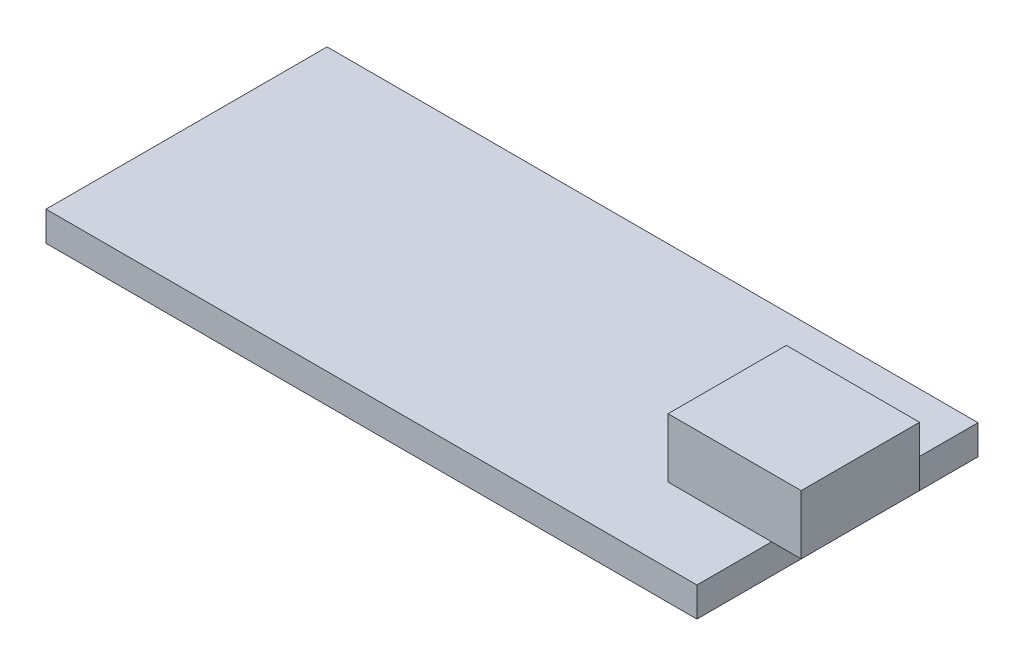
ISO-10303-21;
HEADER;
FILE_DESCRIPTION(('STEP AP214'),'2;1');
FILE_NAME('part.step','',(''),(''),'','','');
FILE_SCHEMA(('AUTOMOTIVE_DESIGN { 1 0 10303 214 1 1 1 1 }'));
ENDSEC;
DATA;
#1=APPLICATION_CONTEXT('core data for automotive mechanical design processes');
#2=APPLICATION_PROTOCOL_DEFINITION('international standard','automotive_design',2000,#1);
#3=PRODUCT_CONTEXT('',#1,'mechanical');
#4=PRODUCT('Part','Part','',(#3));
#5=PRODUCT_RELATED_PRODUCT_CATEGORY('part','',(#4));
#6=PRODUCT_DEFINITION_FORMATION('','',#4);
#7=PRODUCT_DEFINITION_CONTEXT('part definition',#1,'design');
#8=PRODUCT_DEFINITION('design','',#6,#7);
#9=PRODUCT_DEFINITION_SHAPE('','',#8);
#10=(LENGTH_UNIT() NAMED_UNIT(*) SI_UNIT(.MILLI.,.METRE.));
#11=(NAMED_UNIT(*) PLANE_ANGLE_UNIT() SI_UNIT($,.RADIAN.));
#12=(NAMED_UNIT(*) SI_UNIT($,.STERADIAN.) SOLID_ANGLE_UNIT());
#13=UNCERTAINTY_MEASURE_WITH_UNIT(LENGTH_MEASURE(1.E-05),#10,'distance_accuracy_value','');
#14=(GEOMETRIC_REPRESENTATION_CONTEXT(3) GLOBAL_UNCERTAINTY_ASSIGNED_CONTEXT((#13)) GLOBAL_UNIT_ASSIGNED_CONTEXT((#10,
#11,#12)) REPRESENTATION_CONTEXT('',''));
#15=CARTESIAN_POINT('',(0.,0.,0.));
#16=DIRECTION('',(0.,0.,1.));
#17=DIRECTION('',(1.,0.,0.));
#18=AXIS2_PLACEMENT_3D('',#15,#16,#17);
#19=CARTESIAN_POINT('',(0.,2.,0.));
#20=DIRECTION('',(0.,-1.,0.));
#21=DIRECTION('',(0.,0.,-1.));
#22=AXIS2_PLACEMENT_3D('',#19,#20,#21);
#23=PLANE('',#22);
#24=DIRECTION('',(-1.,0.,0.));
#25=VECTOR('',#24,1.);
#26=CARTESIAN_POINT('',(24.,2.,-3.54883693772484));
#27=LINE('',#26,#25);
#28=CARTESIAN_POINT('',(22.,2.,-3.54883693772484));
#29=VERTEX_POINT('',#28);
#30=CARTESIAN_POINT('',(15.,2.,-3.54883693772484));
#31=VERTEX_POINT('',#30);
#32=EDGE_CURVE('E11',#29,#31,#27,.T.);
#33=ORIENTED_EDGE('',*,*,#32,.F.);
#34=DIRECTION('',(0.,0.,-1.));
#35=VECTOR('',#34,1.);
#36=CARTESIAN_POINT('',(22.,2.,9.5));
#37=LINE('',#36,#35);
#38=CARTESIAN_POINT('',(22.,2.,-9.5));
#39=VERTEX_POINT('',#38);
#40=EDGE_CURVE('E150',#29,#39,#37,.T.);
#41=ORIENTED_EDGE('',*,*,#40,.T.);
#42=DIRECTION('',(-1.,0.,0.));
#43=VECTOR('',#42,1.);
#44=CARTESIAN_POINT('',(-22.,2.,-9.5));
#45=LINE('',#44,#43);
#46=CARTESIAN_POINT('',(-22.,2.,-9.5));
#47=VERTEX_POINT('',#46);
#48=EDGE_CURVE('E148',#39,#47,#45,.T.);
#49=ORIENTED_EDGE('',*,*,#48,.T.);
#50=DIRECTION('',(0.,0.,1.));
#51=VECTOR('',#50,1.);
#52=CARTESIAN_POINT('',(-22.,2.,9.5));
#53=LINE('',#52,#51);
#54=CARTESIAN_POINT('',(-22.,2.,9.5));
#55=VERTEX_POINT('',#54);
#56=EDGE_CURVE('E153',#47,#55,#53,.T.);
#57=ORIENTED_EDGE('',*,*,#56,.T.);
#58=DIRECTION('',(1.,0.,0.));
#59=VECTOR('',#58,1.);
#60=CARTESIAN_POINT('',(-22.,2.,9.5));
#61=LINE('',#60,#59);
#62=CARTESIAN_POINT('',(22.,2.,9.5));
#63=VERTEX_POINT('',#62);
#64=EDGE_CURVE('E156',#55,#63,#61,.T.);
#65=ORIENTED_EDGE('',*,*,#64,.T.);
#66=CARTESIAN_POINT('',(22.,2.,4.45116306227516));
#67=VERTEX_POINT('',#66);
#68=EDGE_CURVE('E145',#63,#67,#37,.T.);
#69=ORIENTED_EDGE('',*,*,#68,.T.);
#70=DIRECTION('',(1.,0.,0.));
#71=VECTOR('',#70,1.);
#72=CARTESIAN_POINT('',(24.,2.,4.45116306227516));
#73=LINE('',#72,#71);
#74=CARTESIAN_POINT('',(15.,2.,4.45116306227516));
#75=VERTEX_POINT('',#74);
#76=EDGE_CURVE('E61',#75,#67,#73,.T.);
#77=ORIENTED_EDGE('',*,*,#76,.F.);
#78=DIRECTION('',(0.,0.,1.));
#79=VECTOR('',#78,1.);
#80=CARTESIAN_POINT('',(15.,2.,4.45116306227516));
#81=LINE('',#80,#79);
#82=EDGE_CURVE('E57',#31,#75,#81,.T.);
#83=ORIENTED_EDGE('',*,*,#82,.F.);
#84=EDGE_LOOP('',(#33,#41,#49,#57,#65,#69,#77,#83));
#85=FACE_BOUND('',#84,.T.);
#86=ADVANCED_FACE('F39',(#85),#23,.F.);
#87=CARTESIAN_POINT('',(22.,2.,9.5));
#88=DIRECTION('',(-1.,0.,0.));
#89=DIRECTION('',(0.,0.,1.));
#90=AXIS2_PLACEMENT_3D('',#87,#88,#89);
#91=PLANE('',#90);
#92=DIRECTION('',(0.,0.,-1.));
#93=VECTOR('',#92,1.);
#94=CARTESIAN_POINT('',(22.,0.,9.5));
#95=LINE('',#94,#93);
#96=CARTESIAN_POINT('',(22.,0.,9.5));
#97=VERTEX_POINT('',#96);
#98=CARTESIAN_POINT('',(22.,0.,-9.5));
#99=VERTEX_POINT('',#98);
#100=EDGE_CURVE('E134',#97,#99,#95,.T.);
#101=ORIENTED_EDGE('',*,*,#100,.T.);
#102=DIRECTION('',(0.,-1.,0.));
#103=VECTOR('',#102,1.);
#104=CARTESIAN_POINT('',(22.,2.,-9.5));
#105=LINE('',#104,#103);
#106=EDGE_CURVE('E43',#39,#99,#105,.T.);
#107=ORIENTED_EDGE('',*,*,#106,.F.);
#108=ORIENTED_EDGE('',*,*,#40,.F.);
#109=EDGE_CURVE('E149',#67,#29,#37,.T.);
#110=ORIENTED_EDGE('',*,*,#109,.F.);
#111=ORIENTED_EDGE('',*,*,#68,.F.);
#112=DIRECTION('',(0.,-1.,0.));
#113=VECTOR('',#112,1.);
#114=CARTESIAN_POINT('',(22.,2.,9.5));
#115=LINE('',#114,#113);
#116=EDGE_CURVE('E158',#63,#97,#115,.T.);
#117=ORIENTED_EDGE('',*,*,#116,.T.);
#118=EDGE_LOOP('',(#101,#107,#108,#110,#111,#117));
#119=FACE_BOUND('',#118,.T.);
#120=ADVANCED_FACE('F41',(#119),#91,.F.);
#121=CARTESIAN_POINT('',(-22.,2.,-9.5));
#122=DIRECTION('',(0.,0.,1.));
#123=DIRECTION('',(1.,0.,0.));
#124=AXIS2_PLACEMENT_3D('',#121,#122,#123);
#125=PLANE('',#124);
#126=DIRECTION('',(-1.,0.,0.));
#127=VECTOR('',#126,1.);
#128=CARTESIAN_POINT('',(-22.,0.,-9.5));
#129=LINE('',#128,#127);
#130=CARTESIAN_POINT('',(-22.,0.,-9.5));
#131=VERTEX_POINT('',#130);
#132=EDGE_CURVE('E139',#99,#131,#129,.T.);
#133=ORIENTED_EDGE('',*,*,#132,.T.);
#134=DIRECTION('',(0.,-1.,0.));
#135=VECTOR('',#134,1.);
#136=CARTESIAN_POINT('',(-22.,2.,-9.5));
#137=LINE('',#136,#135);
#138=EDGE_CURVE('E174',#47,#131,#137,.T.);
#139=ORIENTED_EDGE('',*,*,#138,.F.);
#140=ORIENTED_EDGE('',*,*,#48,.F.);
#141=ORIENTED_EDGE('',*,*,#106,.T.);
#142=EDGE_LOOP('',(#133,#139,#140,#141));
#143=FACE_BOUND('',#142,.T.);
#144=ADVANCED_FACE('F186',(#143),#125,.F.);
#145=CARTESIAN_POINT('',(-22.,2.,9.5));
#146=DIRECTION('',(1.,0.,0.));
#147=DIRECTION('',(0.,0.,-1.));
#148=AXIS2_PLACEMENT_3D('',#145,#146,#147);
#149=PLANE('',#148);
#150=DIRECTION('',(0.,0.,1.));
#151=VECTOR('',#150,1.);
#152=CARTESIAN_POINT('',(-22.,0.,9.5));
#153=LINE('',#152,#151);
#154=CARTESIAN_POINT('',(-22.,0.,9.5));
#155=VERTEX_POINT('',#154);
#156=EDGE_CURVE('E162',#131,#155,#153,.T.);
#157=ORIENTED_EDGE('',*,*,#156,.T.);
#158=DIRECTION('',(0.,-1.,0.));
#159=VECTOR('',#158,1.);
#160=CARTESIAN_POINT('',(-22.,2.,9.5));
#161=LINE('',#160,#159);
#162=EDGE_CURVE('E171',#55,#155,#161,.T.);
#163=ORIENTED_EDGE('',*,*,#162,.F.);
#164=ORIENTED_EDGE('',*,*,#56,.F.);
#165=ORIENTED_EDGE('',*,*,#138,.T.);
#166=EDGE_LOOP('',(#157,#163,#164,#165));
#167=FACE_BOUND('',#166,.T.);
#168=ADVANCED_FACE('F196',(#167),#149,.F.);
#169=CARTESIAN_POINT('',(-22.,2.,9.5));
#170=DIRECTION('',(0.,0.,-1.));
#171=DIRECTION('',(-1.,0.,0.));
#172=AXIS2_PLACEMENT_3D('',#169,#170,#171);
#173=PLANE('',#172);
#174=DIRECTION('',(1.,0.,0.));
#175=VECTOR('',#174,1.);
#176=CARTESIAN_POINT('',(-22.,0.,9.5));
#177=LINE('',#176,#175);
#178=EDGE_CURVE('E165',#155,#97,#177,.T.);
#179=ORIENTED_EDGE('',*,*,#178,.T.);
#180=ORIENTED_EDGE('',*,*,#116,.F.);
#181=ORIENTED_EDGE('',*,*,#64,.F.);
#182=ORIENTED_EDGE('',*,*,#162,.T.);
#183=EDGE_LOOP('',(#179,#180,#181,#182));
#184=FACE_BOUND('',#183,.T.);
#185=ADVANCED_FACE('F199',(#184),#173,.F.);
#186=CARTESIAN_POINT('',(0.,0.,0.));
#187=DIRECTION('',(0.,-1.,0.));
#188=DIRECTION('',(0.,0.,-1.));
#189=AXIS2_PLACEMENT_3D('',#186,#187,#188);
#190=PLANE('',#189);
#191=ORIENTED_EDGE('',*,*,#100,.F.);
#192=ORIENTED_EDGE('',*,*,#178,.F.);
#193=ORIENTED_EDGE('',*,*,#156,.F.);
#194=ORIENTED_EDGE('',*,*,#132,.F.);
#195=EDGE_LOOP('',(#191,#192,#193,#194));
#196=FACE_BOUND('',#195,.T.);
#197=ADVANCED_FACE('F194',(#196),#190,.T.);
#198=CARTESIAN_POINT('',(0.,2.,0.));
#199=DIRECTION('',(0.,1.,0.));
#200=DIRECTION('',(0.,0.,1.));
#201=AXIS2_PLACEMENT_3D('',#198,#199,#200);
#202=PLANE('',#201);
#203=CARTESIAN_POINT('',(24.,2.,4.45116306227516));
#204=VERTEX_POINT('',#203);
#205=EDGE_CURVE('E210',#67,#204,#73,.T.);
#206=ORIENTED_EDGE('',*,*,#205,.F.);
#207=ORIENTED_EDGE('',*,*,#109,.T.);
#208=CARTESIAN_POINT('',(24.,2.,-3.54883693772484));
#209=VERTEX_POINT('',#208);
#210=EDGE_CURVE('E50',#209,#29,#27,.T.);
#211=ORIENTED_EDGE('',*,*,#210,.F.);
#212=DIRECTION('',(0.,0.,-1.));
#213=VECTOR('',#212,1.);
#214=CARTESIAN_POINT('',(24.,2.,4.45116306227516));
#215=LINE('',#214,#213);
#216=EDGE_CURVE('E216',#204,#209,#215,.T.);
#217=ORIENTED_EDGE('',*,*,#216,.F.);
#218=EDGE_LOOP('',(#206,#207,#211,#217));
#219=FACE_BOUND('',#218,.T.);
#220=ADVANCED_FACE('F208',(#219),#202,.F.);
#221=CARTESIAN_POINT('',(15.,6.,4.45116306227516));
#222=DIRECTION('',(1.,0.,0.));
#223=DIRECTION('',(0.,0.,-1.));
#224=AXIS2_PLACEMENT_3D('',#221,#222,#223);
#225=PLANE('',#224);
#226=ORIENTED_EDGE('',*,*,#82,.T.);
#227=DIRECTION('',(0.,-1.,0.));
#228=VECTOR('',#227,1.);
#229=CARTESIAN_POINT('',(15.,6.,4.45116306227516));
#230=LINE('',#229,#228);
#231=CARTESIAN_POINT('',(15.,6.,4.45116306227516));
#232=VERTEX_POINT('',#231);
#233=EDGE_CURVE('E114',#232,#75,#230,.T.);
#234=ORIENTED_EDGE('',*,*,#233,.F.);
#235=DIRECTION('',(0.,0.,1.));
#236=VECTOR('',#235,1.);
#237=CARTESIAN_POINT('',(15.,6.,4.45116306227516));
#238=LINE('',#237,#236);
#239=CARTESIAN_POINT('',(15.,6.,-3.54883693772484));
#240=VERTEX_POINT('',#239);
#241=EDGE_CURVE('E121',#240,#232,#238,.T.);
#242=ORIENTED_EDGE('',*,*,#241,.F.);
#243=DIRECTION('',(0.,-1.,0.));
#244=VECTOR('',#243,1.);
#245=CARTESIAN_POINT('',(15.,6.,-3.54883693772484));
#246=LINE('',#245,#244);
#247=EDGE_CURVE('E221',#240,#31,#246,.T.);
#248=ORIENTED_EDGE('',*,*,#247,.T.);
#249=EDGE_LOOP('',(#226,#234,#242,#248));
#250=FACE_BOUND('',#249,.T.);
#251=ADVANCED_FACE('F132',(#250),#225,.F.);
#252=CARTESIAN_POINT('',(24.,6.,4.45116306227516));
#253=DIRECTION('',(0.,0.,-1.));
#254=DIRECTION('',(-1.,0.,0.));
#255=AXIS2_PLACEMENT_3D('',#252,#253,#254);
#256=PLANE('',#255);
#257=ORIENTED_EDGE('',*,*,#76,.T.);
#258=ORIENTED_EDGE('',*,*,#205,.T.);
#259=DIRECTION('',(0.,-1.,0.));
#260=VECTOR('',#259,1.);
#261=CARTESIAN_POINT('',(24.,6.,4.45116306227516));
#262=LINE('',#261,#260);
#263=CARTESIAN_POINT('',(24.,6.,4.45116306227516));
#264=VERTEX_POINT('',#263);
#265=EDGE_CURVE('E116',#264,#204,#262,.T.);
#266=ORIENTED_EDGE('',*,*,#265,.F.);
#267=DIRECTION('',(1.,0.,0.));
#268=VECTOR('',#267,1.);
#269=CARTESIAN_POINT('',(24.,6.,4.45116306227516));
#270=LINE('',#269,#268);
#271=EDGE_CURVE('E110',#232,#264,#270,.T.);
#272=ORIENTED_EDGE('',*,*,#271,.F.);
#273=ORIENTED_EDGE('',*,*,#233,.T.);
#274=EDGE_LOOP('',(#257,#258,#266,#272,#273));
#275=FACE_BOUND('',#274,.T.);
#276=ADVANCED_FACE('F112',(#275),#256,.F.);
#277=CARTESIAN_POINT('',(24.,6.,4.45116306227516));
#278=DIRECTION('',(-1.,0.,0.));
#279=DIRECTION('',(0.,0.,1.));
#280=AXIS2_PLACEMENT_3D('',#277,#278,#279);
#281=PLANE('',#280);
#282=ORIENTED_EDGE('',*,*,#216,.T.);
#283=DIRECTION('',(0.,-1.,0.));
#284=VECTOR('',#283,1.);
#285=CARTESIAN_POINT('',(24.,6.,-3.54883693772484));
#286=LINE('',#285,#284);
#287=CARTESIAN_POINT('',(24.,6.,-3.54883693772484));
#288=VERTEX_POINT('',#287);
#289=EDGE_CURVE('E141',#288,#209,#286,.T.);
#290=ORIENTED_EDGE('',*,*,#289,.F.);
#291=DIRECTION('',(0.,0.,-1.));
#292=VECTOR('',#291,1.);
#293=CARTESIAN_POINT('',(24.,6.,4.45116306227516));
#294=LINE('',#293,#292);
#295=EDGE_CURVE('E120',#264,#288,#294,.T.);
#296=ORIENTED_EDGE('',*,*,#295,.F.);
#297=ORIENTED_EDGE('',*,*,#265,.T.);
#298=EDGE_LOOP('',(#282,#290,#296,#297));
#299=FACE_BOUND('',#298,.T.);
#300=ADVANCED_FACE('F233',(#299),#281,.F.);
#301=CARTESIAN_POINT('',(24.,6.,-3.54883693772484));
#302=DIRECTION('',(0.,0.,1.));
#303=DIRECTION('',(1.,0.,0.));
#304=AXIS2_PLACEMENT_3D('',#301,#302,#303);
#305=PLANE('',#304);
#306=ORIENTED_EDGE('',*,*,#210,.T.);
#307=ORIENTED_EDGE('',*,*,#32,.T.);
#308=ORIENTED_EDGE('',*,*,#247,.F.);
#309=DIRECTION('',(-1.,0.,0.));
#310=VECTOR('',#309,1.);
#311=CARTESIAN_POINT('',(24.,6.,-3.54883693772484));
#312=LINE('',#311,#310);
#313=EDGE_CURVE('E126',#288,#240,#312,.T.);
#314=ORIENTED_EDGE('',*,*,#313,.F.);
#315=ORIENTED_EDGE('',*,*,#289,.T.);
#316=EDGE_LOOP('',(#306,#307,#308,#314,#315));
#317=FACE_BOUND('',#316,.T.);
#318=ADVANCED_FACE('F213',(#317),#305,.F.);
#319=CARTESIAN_POINT('',(0.,6.,0.));
#320=DIRECTION('',(0.,1.,0.));
#321=DIRECTION('',(0.,0.,1.));
#322=AXIS2_PLACEMENT_3D('',#319,#320,#321);
#323=PLANE('',#322);
#324=ORIENTED_EDGE('',*,*,#241,.T.);
#325=ORIENTED_EDGE('',*,*,#271,.T.);
#326=ORIENTED_EDGE('',*,*,#295,.T.);
#327=ORIENTED_EDGE('',*,*,#313,.T.);
#328=EDGE_LOOP('',(#324,#325,#326,#327));
#329=FACE_BOUND('',#328,.T.);
#330=ADVANCED_FACE('F124',(#329),#323,.T.);
#331=CLOSED_SHELL('',(#86,#120,#144,#168,#185,#197,#220,#251,#276,#300,#318,#330));
#332=MANIFOLD_SOLID_BREP('B2',#331);
#333=ADVANCED_BREP_SHAPE_REPRESENTATION('',(#18,#332),#14);
#334=SHAPE_DEFINITION_REPRESENTATION(#9,#333);
ENDSEC;
END-ISO-10303-21;
